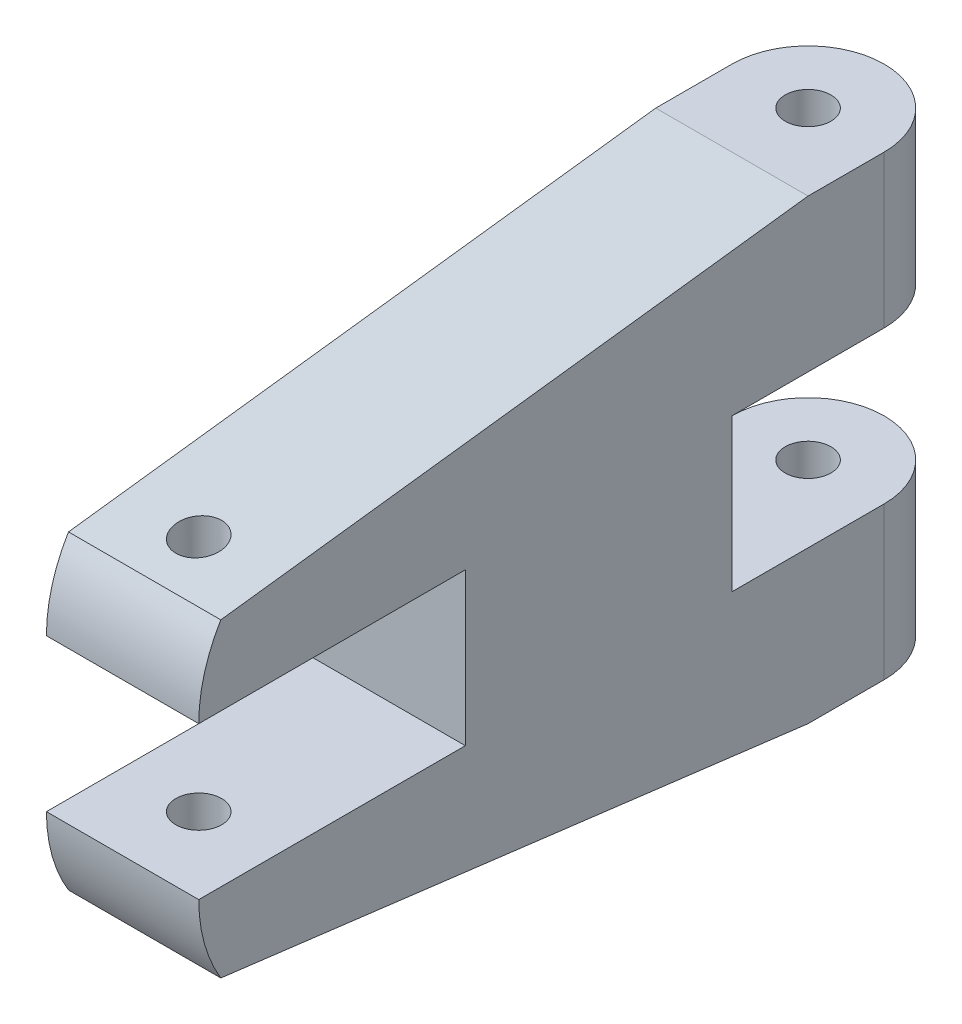
ISO-10303-21;
HEADER;
FILE_DESCRIPTION(('STEP AP214'),'2;1');
FILE_NAME('part.step','',(''),(''),'','','');
FILE_SCHEMA(('AUTOMOTIVE_DESIGN { 1 0 10303 214 1 1 1 1 }'));
ENDSEC;
DATA;
#1=APPLICATION_CONTEXT('core data for automotive mechanical design processes');
#2=APPLICATION_PROTOCOL_DEFINITION('international standard','automotive_design',2000,#1);
#3=PRODUCT_CONTEXT('',#1,'mechanical');
#4=PRODUCT('Part','Part','',(#3));
#5=PRODUCT_RELATED_PRODUCT_CATEGORY('part','',(#4));
#6=PRODUCT_DEFINITION_FORMATION('','',#4);
#7=PRODUCT_DEFINITION_CONTEXT('part definition',#1,'design');
#8=PRODUCT_DEFINITION('design','',#6,#7);
#9=PRODUCT_DEFINITION_SHAPE('','',#8);
#10=(LENGTH_UNIT() NAMED_UNIT(*) SI_UNIT(.MILLI.,.METRE.));
#11=(NAMED_UNIT(*) PLANE_ANGLE_UNIT() SI_UNIT($,.RADIAN.));
#12=(NAMED_UNIT(*) SI_UNIT($,.STERADIAN.) SOLID_ANGLE_UNIT());
#13=UNCERTAINTY_MEASURE_WITH_UNIT(LENGTH_MEASURE(1.E-05),#10,'distance_accuracy_value','');
#14=(GEOMETRIC_REPRESENTATION_CONTEXT(3) GLOBAL_UNCERTAINTY_ASSIGNED_CONTEXT((#13)) GLOBAL_UNIT_ASSIGNED_CONTEXT((#10,
#11,#12)) REPRESENTATION_CONTEXT('',''));
#15=CARTESIAN_POINT('',(0.,0.,0.));
#16=DIRECTION('',(0.,0.,1.));
#17=DIRECTION('',(1.,0.,0.));
#18=AXIS2_PLACEMENT_3D('',#15,#16,#17);
#19=CARTESIAN_POINT('',(5.,29.,-20.));
#20=DIRECTION('',(0.,-1.,0.));
#21=DIRECTION('',(0.,0.,-1.));
#22=AXIS2_PLACEMENT_3D('',#19,#20,#21);
#23=CYLINDRICAL_SURFACE('',#22,1.5);
#24=CARTESIAN_POINT('',(5.,-5.,-20.));
#25=DIRECTION('',(0.,-1.,0.));
#26=DIRECTION('',(0.,0.,-1.));
#27=AXIS2_PLACEMENT_3D('',#24,#25,#26);
#28=CIRCLE('',#27,1.5);
#29=CARTESIAN_POINT('',(5.,-5.,-21.5));
#30=VERTEX_POINT('',#29);
#31=EDGE_CURVE('E212',#30,#30,#28,.F.);
#32=CARTESIAN_POINT('',(5.,-15.,-20.));
#33=DIRECTION('',(0.,1.,0.));
#34=DIRECTION('',(0.,0.,1.));
#35=AXIS2_PLACEMENT_3D('',#32,#33,#34);
#36=CIRCLE('',#35,1.5);
#37=CARTESIAN_POINT('',(5.,-15.,-21.5));
#38=VERTEX_POINT('',#37);
#39=EDGE_CURVE('E202',#38,#38,#36,.T.);
#40=CARTESIAN_POINT('',(5.,-5.,-21.5));
#41=CARTESIAN_POINT('',(5.,-5.10416666666666,-21.5));
#42=CARTESIAN_POINT('',(5.,-5.20833333333333,-21.5));
#43=CARTESIAN_POINT('',(5.,-5.41666666666666,-21.5));
#44=CARTESIAN_POINT('',(5.,-5.52083333333333,-21.5));
#45=CARTESIAN_POINT('',(5.,-5.72916666666666,-21.5));
#46=CARTESIAN_POINT('',(5.,-5.83333333333333,-21.5));
#47=CARTESIAN_POINT('',(5.,-6.04166666666667,-21.5));
#48=CARTESIAN_POINT('',(5.,-6.14583333333333,-21.5));
#49=CARTESIAN_POINT('',(5.,-6.35416666666667,-21.5));
#50=CARTESIAN_POINT('',(5.,-6.45833333333333,-21.5));
#51=CARTESIAN_POINT('',(5.,-6.66666666666667,-21.5));
#52=CARTESIAN_POINT('',(5.,-6.77083333333333,-21.5));
#53=CARTESIAN_POINT('',(5.,-6.97916666666667,-21.5));
#54=CARTESIAN_POINT('',(5.,-7.08333333333333,-21.5));
#55=CARTESIAN_POINT('',(5.,-7.29166666666667,-21.5));
#56=CARTESIAN_POINT('',(5.,-7.39583333333333,-21.5));
#57=CARTESIAN_POINT('',(5.,-7.60416666666667,-21.5));
#58=CARTESIAN_POINT('',(5.,-7.70833333333333,-21.5));
#59=CARTESIAN_POINT('',(5.,-7.91666666666667,-21.5));
#60=CARTESIAN_POINT('',(5.,-8.02083333333333,-21.5));
#61=CARTESIAN_POINT('',(5.,-8.22916666666667,-21.5));
#62=CARTESIAN_POINT('',(5.,-8.33333333333333,-21.5));
#63=CARTESIAN_POINT('',(5.,-8.54166666666667,-21.5));
#64=CARTESIAN_POINT('',(5.,-8.64583333333333,-21.5));
#65=CARTESIAN_POINT('',(5.,-8.85416666666667,-21.5));
#66=CARTESIAN_POINT('',(5.,-8.95833333333333,-21.5));
#67=CARTESIAN_POINT('',(5.,-9.16666666666667,-21.5));
#68=CARTESIAN_POINT('',(5.,-9.27083333333333,-21.5));
#69=CARTESIAN_POINT('',(5.,-9.47916666666667,-21.5));
#70=CARTESIAN_POINT('',(5.,-9.58333333333333,-21.5));
#71=CARTESIAN_POINT('',(5.,-9.79166666666667,-21.5));
#72=CARTESIAN_POINT('',(5.,-9.89583333333333,-21.5));
#73=CARTESIAN_POINT('',(5.,-10.1041666666667,-21.5));
#74=CARTESIAN_POINT('',(5.,-10.2083333333333,-21.5));
#75=CARTESIAN_POINT('',(5.,-10.4166666666667,-21.5));
#76=CARTESIAN_POINT('',(5.,-10.5208333333333,-21.5));
#77=CARTESIAN_POINT('',(5.,-10.7291666666667,-21.5));
#78=CARTESIAN_POINT('',(5.,-10.8333333333333,-21.5));
#79=CARTESIAN_POINT('',(5.,-11.0416666666667,-21.5));
#80=CARTESIAN_POINT('',(5.,-11.1458333333333,-21.5));
#81=CARTESIAN_POINT('',(5.,-11.3541666666667,-21.5));
#82=CARTESIAN_POINT('',(5.,-11.4583333333333,-21.5));
#83=CARTESIAN_POINT('',(5.,-11.6666666666667,-21.5));
#84=CARTESIAN_POINT('',(5.,-11.7708333333333,-21.5));
#85=CARTESIAN_POINT('',(5.,-11.9791666666667,-21.5));
#86=CARTESIAN_POINT('',(5.,-12.0833333333333,-21.5));
#87=CARTESIAN_POINT('',(5.,-12.2916666666667,-21.5));
#88=CARTESIAN_POINT('',(5.,-12.3958333333333,-21.5));
#89=CARTESIAN_POINT('',(5.,-12.6041666666667,-21.5));
#90=CARTESIAN_POINT('',(5.,-12.7083333333333,-21.5));
#91=CARTESIAN_POINT('',(5.,-12.9166666666667,-21.5));
#92=CARTESIAN_POINT('',(5.,-13.0208333333333,-21.5));
#93=CARTESIAN_POINT('',(5.,-13.2291666666667,-21.5));
#94=CARTESIAN_POINT('',(5.,-13.3333333333333,-21.5));
#95=CARTESIAN_POINT('',(5.,-13.5416666666667,-21.5));
#96=CARTESIAN_POINT('',(5.,-13.6458333333333,-21.5));
#97=CARTESIAN_POINT('',(5.,-13.8541666666667,-21.5));
#98=CARTESIAN_POINT('',(5.,-13.9583333333333,-21.5));
#99=CARTESIAN_POINT('',(5.,-14.1666666666667,-21.5));
#100=CARTESIAN_POINT('',(5.,-14.2708333333333,-21.5));
#101=CARTESIAN_POINT('',(5.,-14.4791666666667,-21.5));
#102=CARTESIAN_POINT('',(5.,-14.5833333333333,-21.5));
#103=CARTESIAN_POINT('',(5.,-14.7916666666667,-21.5));
#104=CARTESIAN_POINT('',(5.,-14.8958333333333,-21.5));
#105=CARTESIAN_POINT('',(5.,-15.,-21.5));
#106=B_SPLINE_CURVE_WITH_KNOTS('',3,(#40,#41,#42,#43,#44,#45,#46,#47,#48,#49,#50,#51,#52,#53,
#54,#55,#56,#57,#58,#59,#60,#61,#62,#63,#64,#65,#66,#67,#68,#69,#70,#71,#72,#73,#74,#75,#76,#77,
#78,#79,#80,#81,#82,#83,#84,#85,#86,#87,#88,#89,#90,#91,#92,#93,#94,#95,#96,#97,#98,#99,#100,
#101,#102,#103,#104,#105),.UNSPECIFIED.,.F.,.F.,(4,2,2,2,2,2,2,2,2,2,2,2,2,2,2,2,2,2,2,2,2,2,2,
2,2,2,2,2,2,2,2,2,4),(0.,0.3125,0.625000000000001,0.937500000000001,1.25,1.5625,1.875,2.1875,
2.5,2.8125,3.125,3.4375,3.75,4.0625,4.375,4.6875,5.,5.3125,5.62500000000001,5.93750000000001,
6.25000000000001,6.56250000000001,6.87500000000001,7.18750000000001,7.50000000000001,
7.81250000000001,8.12500000000001,8.43750000000001,8.75000000000001,9.06250000000001,
9.37500000000001,9.68750000000001,10.),.UNSPECIFIED.);
#107=EDGE_CURVE('BSEAM33',#30,#38,#106,.T.);
#108=ORIENTED_EDGE('',*,*,#31,.T.);
#109=ORIENTED_EDGE('',*,*,#39,.F.);
#110=ORIENTED_EDGE('',*,*,#107,.T.);
#111=ORIENTED_EDGE('',*,*,#107,.F.);
#112=EDGE_LOOP('',(#108,#110,#109,#111));
#113=FACE_BOUND('',#112,.T.);
#114=ADVANCED_FACE('F33',(#113),#23,.F.);
#115=CARTESIAN_POINT('',(10.,15.,25.));
#116=DIRECTION('',(0.,-1.,0.));
#117=DIRECTION('',(0.,0.,-1.));
#118=AXIS2_PLACEMENT_3D('',#115,#116,#117);
#119=PLANE('',#118);
#120=CARTESIAN_POINT('',(5.,15.,-20.));
#121=DIRECTION('',(0.,-1.,0.));
#122=DIRECTION('',(0.,0.,-1.));
#123=AXIS2_PLACEMENT_3D('',#120,#121,#122);
#124=CIRCLE('',#123,1.5);
#125=CARTESIAN_POINT('',(5.,15.,-21.5));
#126=VERTEX_POINT('',#125);
#127=EDGE_CURVE('E205',#126,#126,#124,.T.);
#128=ORIENTED_EDGE('',*,*,#127,.T.);
#129=EDGE_LOOP('',(#128));
#130=FACE_BOUND('',#129,.T.);
#131=DIRECTION('',(0.,0.,1.));
#132=VECTOR('',#131,1.);
#133=CARTESIAN_POINT('',(0.,15.,25.));
#134=LINE('',#133,#132);
#135=CARTESIAN_POINT('',(0.,15.,-20.));
#136=VERTEX_POINT('',#135);
#137=CARTESIAN_POINT('',(0.,15.,-15.));
#138=VERTEX_POINT('',#137);
#139=EDGE_CURVE('E282',#136,#138,#134,.T.);
#140=ORIENTED_EDGE('',*,*,#139,.T.);
#141=DIRECTION('',(1.,0.,0.));
#142=VECTOR('',#141,1.);
#143=CARTESIAN_POINT('',(0.,15.,-15.));
#144=LINE('',#143,#142);
#145=CARTESIAN_POINT('',(10.,15.,-15.));
#146=VERTEX_POINT('',#145);
#147=EDGE_CURVE('E248',#138,#146,#144,.T.);
#148=ORIENTED_EDGE('',*,*,#147,.T.);
#149=DIRECTION('',(0.,0.,1.));
#150=VECTOR('',#149,1.);
#151=CARTESIAN_POINT('',(10.,15.,25.));
#152=LINE('',#151,#150);
#153=CARTESIAN_POINT('',(10.,15.,-20.));
#154=VERTEX_POINT('',#153);
#155=EDGE_CURVE('E168',#154,#146,#152,.T.);
#156=ORIENTED_EDGE('',*,*,#155,.F.);
#157=CARTESIAN_POINT('',(5.,15.,-20.));
#158=DIRECTION('',(0.,-1.,0.));
#159=DIRECTION('',(0.,0.,-1.));
#160=AXIS2_PLACEMENT_3D('',#157,#158,#159);
#161=CIRCLE('',#160,5.);
#162=CARTESIAN_POINT('',(5.,15.,-25.));
#163=VERTEX_POINT('',#162);
#164=EDGE_CURVE('E225',#154,#163,#161,.F.);
#165=ORIENTED_EDGE('',*,*,#164,.T.);
#166=CARTESIAN_POINT('',(5.,15.,-20.));
#167=DIRECTION('',(0.,-1.,0.));
#168=DIRECTION('',(0.,0.,-1.));
#169=AXIS2_PLACEMENT_3D('',#166,#167,#168);
#170=CIRCLE('',#169,5.);
#171=EDGE_CURVE('E223',#163,#136,#170,.F.);
#172=ORIENTED_EDGE('',*,*,#171,.T.);
#173=EDGE_LOOP('',(#140,#148,#156,#165,#172));
#174=FACE_BOUND('',#173,.T.);
#175=ADVANCED_FACE('F335',(#130,#174),#119,.F.);
#176=CARTESIAN_POINT('',(10.,5.,7.5));
#177=DIRECTION('',(0.,1.,0.));
#178=DIRECTION('',(0.,0.,1.));
#179=AXIS2_PLACEMENT_3D('',#176,#177,#178);
#180=PLANE('',#179);
#181=CARTESIAN_POINT('',(5.,5.,20.));
#182=DIRECTION('',(0.,1.,0.));
#183=DIRECTION('',(0.,0.,1.));
#184=AXIS2_PLACEMENT_3D('',#181,#182,#183);
#185=CIRCLE('',#184,1.5);
#186=CARTESIAN_POINT('',(5.,5.,21.5));
#187=VERTEX_POINT('',#186);
#188=EDGE_CURVE('E280',#187,#187,#185,.T.);
#189=ORIENTED_EDGE('',*,*,#188,.T.);
#190=EDGE_LOOP('',(#189));
#191=FACE_BOUND('',#190,.T.);
#192=DIRECTION('',(0.,0.,-1.));
#193=VECTOR('',#192,1.);
#194=CARTESIAN_POINT('',(0.,5.,7.5));
#195=LINE('',#194,#193);
#196=CARTESIAN_POINT('',(0.,5.,25.));
#197=VERTEX_POINT('',#196);
#198=CARTESIAN_POINT('',(0.,5.,7.5));
#199=VERTEX_POINT('',#198);
#200=EDGE_CURVE('E291',#197,#199,#195,.T.);
#201=ORIENTED_EDGE('',*,*,#200,.T.);
#202=DIRECTION('',(-1.,0.,0.));
#203=VECTOR('',#202,1.);
#204=CARTESIAN_POINT('',(10.,5.,7.5));
#205=LINE('',#204,#203);
#206=CARTESIAN_POINT('',(10.,5.,7.5));
#207=VERTEX_POINT('',#206);
#208=EDGE_CURVE('E185',#207,#199,#205,.T.);
#209=ORIENTED_EDGE('',*,*,#208,.F.);
#210=DIRECTION('',(0.,0.,-1.));
#211=VECTOR('',#210,1.);
#212=CARTESIAN_POINT('',(10.,5.,7.5));
#213=LINE('',#212,#211);
#214=CARTESIAN_POINT('',(10.,5.,25.));
#215=VERTEX_POINT('',#214);
#216=EDGE_CURVE('E172',#215,#207,#213,.T.);
#217=ORIENTED_EDGE('',*,*,#216,.F.);
#218=DIRECTION('',(-1.,0.,0.));
#219=VECTOR('',#218,1.);
#220=CARTESIAN_POINT('',(10.,5.,25.));
#221=LINE('',#220,#219);
#222=EDGE_CURVE('E188',#215,#197,#221,.T.);
#223=ORIENTED_EDGE('',*,*,#222,.T.);
#224=EDGE_LOOP('',(#201,#209,#217,#223));
#225=FACE_BOUND('',#224,.T.);
#226=ADVANCED_FACE('F314',(#191,#225),#180,.F.);
#227=CARTESIAN_POINT('',(10.,5.,7.5));
#228=DIRECTION('',(0.,0.,-1.));
#229=DIRECTION('',(0.,1.,0.));
#230=AXIS2_PLACEMENT_3D('',#227,#228,#229);
#231=PLANE('',#230);
#232=DIRECTION('',(0.,-1.,0.));
#233=VECTOR('',#232,1.);
#234=CARTESIAN_POINT('',(0.,5.,7.5));
#235=LINE('',#234,#233);
#236=CARTESIAN_POINT('',(0.,-5.,7.5));
#237=VERTEX_POINT('',#236);
#238=EDGE_CURVE('E175',#199,#237,#235,.T.);
#239=ORIENTED_EDGE('',*,*,#238,.T.);
#240=DIRECTION('',(-1.,0.,0.));
#241=VECTOR('',#240,1.);
#242=CARTESIAN_POINT('',(10.,-5.,7.5));
#243=LINE('',#242,#241);
#244=CARTESIAN_POINT('',(10.,-5.,7.5));
#245=VERTEX_POINT('',#244);
#246=EDGE_CURVE('E182',#245,#237,#243,.T.);
#247=ORIENTED_EDGE('',*,*,#246,.F.);
#248=DIRECTION('',(0.,-1.,0.));
#249=VECTOR('',#248,1.);
#250=CARTESIAN_POINT('',(10.,5.,7.5));
#251=LINE('',#250,#249);
#252=EDGE_CURVE('E285',#207,#245,#251,.T.);
#253=ORIENTED_EDGE('',*,*,#252,.F.);
#254=ORIENTED_EDGE('',*,*,#208,.T.);
#255=EDGE_LOOP('',(#239,#247,#253,#254));
#256=FACE_BOUND('',#255,.T.);
#257=ADVANCED_FACE('F295',(#256),#231,.F.);
#258=CARTESIAN_POINT('',(10.,-5.,7.5));
#259=DIRECTION('',(0.,-1.,0.));
#260=DIRECTION('',(0.,0.,-1.));
#261=AXIS2_PLACEMENT_3D('',#258,#259,#260);
#262=PLANE('',#261);
#263=CARTESIAN_POINT('',(5.,-5.,20.));
#264=DIRECTION('',(0.,-1.,0.));
#265=DIRECTION('',(0.,0.,-1.));
#266=AXIS2_PLACEMENT_3D('',#263,#264,#265);
#267=CIRCLE('',#266,1.5);
#268=CARTESIAN_POINT('',(5.,-5.,18.5));
#269=VERTEX_POINT('',#268);
#270=EDGE_CURVE('E277',#269,#269,#267,.T.);
#271=ORIENTED_EDGE('',*,*,#270,.T.);
#272=EDGE_LOOP('',(#271));
#273=FACE_BOUND('',#272,.T.);
#274=DIRECTION('',(0.,0.,1.));
#275=VECTOR('',#274,1.);
#276=CARTESIAN_POINT('',(0.,-5.,7.5));
#277=LINE('',#276,#275);
#278=CARTESIAN_POINT('',(0.,-5.,25.));
#279=VERTEX_POINT('',#278);
#280=EDGE_CURVE('E169',#237,#279,#277,.T.);
#281=ORIENTED_EDGE('',*,*,#280,.T.);
#282=DIRECTION('',(-1.,0.,0.));
#283=VECTOR('',#282,1.);
#284=CARTESIAN_POINT('',(10.,-5.,25.));
#285=LINE('',#284,#283);
#286=CARTESIAN_POINT('',(10.,-5.,25.));
#287=VERTEX_POINT('',#286);
#288=EDGE_CURVE('E179',#287,#279,#285,.T.);
#289=ORIENTED_EDGE('',*,*,#288,.F.);
#290=DIRECTION('',(0.,0.,1.));
#291=VECTOR('',#290,1.);
#292=CARTESIAN_POINT('',(10.,-5.,7.5));
#293=LINE('',#292,#291);
#294=EDGE_CURVE('E287',#245,#287,#293,.T.);
#295=ORIENTED_EDGE('',*,*,#294,.F.);
#296=ORIENTED_EDGE('',*,*,#246,.T.);
#297=EDGE_LOOP('',(#281,#289,#295,#296));
#298=FACE_BOUND('',#297,.T.);
#299=ADVANCED_FACE('F302',(#273,#298),#262,.F.);
#300=CARTESIAN_POINT('',(10.,-15.,25.));
#301=DIRECTION('',(0.,1.,0.));
#302=DIRECTION('',(0.,0.,1.));
#303=AXIS2_PLACEMENT_3D('',#300,#301,#302);
#304=PLANE('',#303);
#305=ORIENTED_EDGE('',*,*,#39,.T.);
#306=EDGE_LOOP('',(#305));
#307=FACE_BOUND('',#306,.T.);
#308=DIRECTION('',(0.,0.,-1.));
#309=VECTOR('',#308,1.);
#310=CARTESIAN_POINT('',(10.,-15.,25.));
#311=LINE('',#310,#309);
#312=CARTESIAN_POINT('',(10.,-15.,-15.));
#313=VERTEX_POINT('',#312);
#314=CARTESIAN_POINT('',(10.,-15.,-20.));
#315=VERTEX_POINT('',#314);
#316=EDGE_CURVE('E161',#313,#315,#311,.T.);
#317=ORIENTED_EDGE('',*,*,#316,.F.);
#318=DIRECTION('',(1.,0.,0.));
#319=VECTOR('',#318,1.);
#320=CARTESIAN_POINT('',(0.,-15.,-15.));
#321=LINE('',#320,#319);
#322=CARTESIAN_POINT('',(0.,-15.,-15.));
#323=VERTEX_POINT('',#322);
#324=EDGE_CURVE('E150',#323,#313,#321,.T.);
#325=ORIENTED_EDGE('',*,*,#324,.F.);
#326=DIRECTION('',(0.,0.,-1.));
#327=VECTOR('',#326,1.);
#328=CARTESIAN_POINT('',(0.,-15.,25.));
#329=LINE('',#328,#327);
#330=CARTESIAN_POINT('',(0.,-15.,-20.));
#331=VERTEX_POINT('',#330);
#332=EDGE_CURVE('E159',#323,#331,#329,.T.);
#333=ORIENTED_EDGE('',*,*,#332,.T.);
#334=CARTESIAN_POINT('',(5.,-15.,-20.));
#335=DIRECTION('',(0.,1.,0.));
#336=DIRECTION('',(0.,0.,1.));
#337=AXIS2_PLACEMENT_3D('',#334,#335,#336);
#338=CIRCLE('',#337,5.);
#339=CARTESIAN_POINT('',(5.,-15.,-25.));
#340=VERTEX_POINT('',#339);
#341=EDGE_CURVE('E42',#331,#340,#338,.F.);
#342=ORIENTED_EDGE('',*,*,#341,.T.);
#343=CARTESIAN_POINT('',(5.,-15.,-20.));
#344=DIRECTION('',(0.,1.,0.));
#345=DIRECTION('',(0.,0.,1.));
#346=AXIS2_PLACEMENT_3D('',#343,#344,#345);
#347=CIRCLE('',#346,5.);
#348=EDGE_CURVE('E11',#340,#315,#347,.F.);
#349=ORIENTED_EDGE('',*,*,#348,.T.);
#350=EDGE_LOOP('',(#317,#325,#333,#342,#349));
#351=FACE_BOUND('',#350,.T.);
#352=ADVANCED_FACE('F158',(#307,#351),#304,.F.);
#353=CARTESIAN_POINT('',(10.,0.,0.));
#354=DIRECTION('',(-1.,0.,0.));
#355=DIRECTION('',(0.,0.,1.));
#356=AXIS2_PLACEMENT_3D('',#353,#354,#355);
#357=PLANE('',#356);
#358=CARTESIAN_POINT('',(10.,-5.,15.));
#359=DIRECTION('',(-1.,0.,0.));
#360=DIRECTION('',(0.,0.,1.));
#361=AXIS2_PLACEMENT_3D('',#358,#359,#360);
#362=CIRCLE('',#361,10.);
#363=CARTESIAN_POINT('',(10.,-10.1808376430251,23.5532988557991));
#364=VERTEX_POINT('',#363);
#365=EDGE_CURVE('E196',#287,#364,#362,.F.);
#366=ORIENTED_EDGE('',*,*,#365,.T.);
#367=DIRECTION('',(0.,0.124034734589209,0.992277876713668));
#368=VECTOR('',#367,1.);
#369=CARTESIAN_POINT('',(10.,-10.,25.));
#370=LINE('',#369,#368);
#371=EDGE_CURVE('E50',#313,#364,#370,.T.);
#372=ORIENTED_EDGE('',*,*,#371,.F.);
#373=ORIENTED_EDGE('',*,*,#316,.T.);
#374=DIRECTION('',(0.,1.,0.));
#375=VECTOR('',#374,1.);
#376=CARTESIAN_POINT('',(10.,0.,-20.));
#377=LINE('',#376,#375);
#378=CARTESIAN_POINT('',(10.,-5.,-20.));
#379=VERTEX_POINT('',#378);
#380=EDGE_CURVE('E217',#315,#379,#377,.T.);
#381=ORIENTED_EDGE('',*,*,#380,.T.);
#382=DIRECTION('',(0.,0.,-1.));
#383=VECTOR('',#382,1.);
#384=CARTESIAN_POINT('',(10.,-5.,-25.));
#385=LINE('',#384,#383);
#386=CARTESIAN_POINT('',(10.,-5.,-10.));
#387=VERTEX_POINT('',#386);
#388=EDGE_CURVE('E265',#387,#379,#385,.T.);
#389=ORIENTED_EDGE('',*,*,#388,.F.);
#390=DIRECTION('',(0.,-1.,0.));
#391=VECTOR('',#390,1.);
#392=CARTESIAN_POINT('',(10.,-5.,-10.));
#393=LINE('',#392,#391);
#394=CARTESIAN_POINT('',(10.,5.,-10.));
#395=VERTEX_POINT('',#394);
#396=EDGE_CURVE('E262',#395,#387,#393,.T.);
#397=ORIENTED_EDGE('',*,*,#396,.F.);
#398=DIRECTION('',(0.,0.,1.));
#399=VECTOR('',#398,1.);
#400=CARTESIAN_POINT('',(10.,5.,-25.));
#401=LINE('',#400,#399);
#402=CARTESIAN_POINT('',(10.,5.,-20.));
#403=VERTEX_POINT('',#402);
#404=EDGE_CURVE('E242',#403,#395,#401,.T.);
#405=ORIENTED_EDGE('',*,*,#404,.F.);
#406=DIRECTION('',(0.,1.,0.));
#407=VECTOR('',#406,1.);
#408=CARTESIAN_POINT('',(10.,0.,-20.));
#409=LINE('',#408,#407);
#410=EDGE_CURVE('E220',#403,#154,#409,.T.);
#411=ORIENTED_EDGE('',*,*,#410,.T.);
#412=ORIENTED_EDGE('',*,*,#155,.T.);
#413=DIRECTION('',(0.,0.124034734589209,-0.992277876713668));
#414=VECTOR('',#413,1.);
#415=CARTESIAN_POINT('',(10.,10.,25.));
#416=LINE('',#415,#414);
#417=CARTESIAN_POINT('',(10.,10.1808376430251,23.5532988557991));
#418=VERTEX_POINT('',#417);
#419=EDGE_CURVE('E257',#418,#146,#416,.T.);
#420=ORIENTED_EDGE('',*,*,#419,.F.);
#421=CARTESIAN_POINT('',(10.,5.,15.));
#422=DIRECTION('',(-1.,0.,0.));
#423=DIRECTION('',(0.,0.,1.));
#424=AXIS2_PLACEMENT_3D('',#421,#422,#423);
#425=CIRCLE('',#424,10.);
#426=EDGE_CURVE('E199',#418,#215,#425,.F.);
#427=ORIENTED_EDGE('',*,*,#426,.T.);
#428=ORIENTED_EDGE('',*,*,#216,.T.);
#429=ORIENTED_EDGE('',*,*,#252,.T.);
#430=ORIENTED_EDGE('',*,*,#294,.T.);
#431=EDGE_LOOP('',(#366,#372,#373,#381,#389,#397,#405,#411,#412,#420,#427,#428,#429,#430));
#432=FACE_BOUND('',#431,.T.);
#433=ADVANCED_FACE('F308',(#432),#357,.F.);
#434=CARTESIAN_POINT('',(0.,0.,0.));
#435=DIRECTION('',(-1.,0.,0.));
#436=DIRECTION('',(0.,0.,1.));
#437=AXIS2_PLACEMENT_3D('',#434,#435,#436);
#438=PLANE('',#437);
#439=DIRECTION('',(0.,0.124034734589209,0.992277876713668));
#440=VECTOR('',#439,1.);
#441=CARTESIAN_POINT('',(0.,-10.,25.));
#442=LINE('',#441,#440);
#443=CARTESIAN_POINT('',(0.,-10.1808376430251,23.5532988557991));
#444=VERTEX_POINT('',#443);
#445=EDGE_CURVE('E146',#323,#444,#442,.T.);
#446=ORIENTED_EDGE('',*,*,#445,.T.);
#447=CARTESIAN_POINT('',(0.,-5.,15.));
#448=DIRECTION('',(-1.,0.,0.));
#449=DIRECTION('',(0.,0.,1.));
#450=AXIS2_PLACEMENT_3D('',#447,#448,#449);
#451=CIRCLE('',#450,10.);
#452=EDGE_CURVE('E191',#444,#279,#451,.T.);
#453=ORIENTED_EDGE('',*,*,#452,.T.);
#454=ORIENTED_EDGE('',*,*,#280,.F.);
#455=ORIENTED_EDGE('',*,*,#238,.F.);
#456=ORIENTED_EDGE('',*,*,#200,.F.);
#457=CARTESIAN_POINT('',(0.,5.,15.));
#458=DIRECTION('',(-1.,0.,0.));
#459=DIRECTION('',(0.,0.,1.));
#460=AXIS2_PLACEMENT_3D('',#457,#458,#459);
#461=CIRCLE('',#460,10.);
#462=CARTESIAN_POINT('',(0.,10.1808376430251,23.5532988557991));
#463=VERTEX_POINT('',#462);
#464=EDGE_CURVE('E193',#197,#463,#461,.T.);
#465=ORIENTED_EDGE('',*,*,#464,.T.);
#466=DIRECTION('',(0.,0.124034734589209,-0.992277876713668));
#467=VECTOR('',#466,1.);
#468=CARTESIAN_POINT('',(0.,10.,25.));
#469=LINE('',#468,#467);
#470=EDGE_CURVE('E58',#463,#138,#469,.T.);
#471=ORIENTED_EDGE('',*,*,#470,.T.);
#472=ORIENTED_EDGE('',*,*,#139,.F.);
#473=DIRECTION('',(0.,1.,0.));
#474=VECTOR('',#473,1.);
#475=CARTESIAN_POINT('',(0.,5.,-20.));
#476=LINE('',#475,#474);
#477=CARTESIAN_POINT('',(0.,5.,-20.));
#478=VERTEX_POINT('',#477);
#479=EDGE_CURVE('E232',#136,#478,#476,.F.);
#480=ORIENTED_EDGE('',*,*,#479,.T.);
#481=DIRECTION('',(0.,0.,-1.));
#482=VECTOR('',#481,1.);
#483=CARTESIAN_POINT('',(0.,5.,0.));
#484=LINE('',#483,#482);
#485=CARTESIAN_POINT('',(0.,5.,-10.));
#486=VERTEX_POINT('',#485);
#487=EDGE_CURVE('E210',#486,#478,#484,.T.);
#488=ORIENTED_EDGE('',*,*,#487,.F.);
#489=DIRECTION('',(0.,1.,0.));
#490=VECTOR('',#489,1.);
#491=CARTESIAN_POINT('',(0.,0.,-10.));
#492=LINE('',#491,#490);
#493=CARTESIAN_POINT('',(0.,-5.,-10.));
#494=VERTEX_POINT('',#493);
#495=EDGE_CURVE('E201',#494,#486,#492,.T.);
#496=ORIENTED_EDGE('',*,*,#495,.F.);
#497=DIRECTION('',(0.,0.,1.));
#498=VECTOR('',#497,1.);
#499=CARTESIAN_POINT('',(0.,-5.,0.));
#500=LINE('',#499,#498);
#501=CARTESIAN_POINT('',(0.,-5.,-20.));
#502=VERTEX_POINT('',#501);
#503=EDGE_CURVE('E206',#502,#494,#500,.T.);
#504=ORIENTED_EDGE('',*,*,#503,.F.);
#505=DIRECTION('',(0.,1.,0.));
#506=VECTOR('',#505,1.);
#507=CARTESIAN_POINT('',(0.,-15.,-20.));
#508=LINE('',#507,#506);
#509=EDGE_CURVE('E166',#502,#331,#508,.F.);
#510=ORIENTED_EDGE('',*,*,#509,.T.);
#511=ORIENTED_EDGE('',*,*,#332,.F.);
#512=EDGE_LOOP('',(#446,#453,#454,#455,#456,#465,#471,#472,#480,#488,#496,#504,#510,#511));
#513=FACE_BOUND('',#512,.T.);
#514=ADVANCED_FACE('F163',(#513),#438,.T.);
#515=CARTESIAN_POINT('',(10.,5.,15.));
#516=DIRECTION('',(-1.,0.,0.));
#517=DIRECTION('',(0.,0.,1.));
#518=AXIS2_PLACEMENT_3D('',#515,#516,#517);
#519=CYLINDRICAL_SURFACE('',#518,10.);
#520=DIRECTION('',(-1.,0.,0.));
#521=VECTOR('',#520,1.);
#522=CARTESIAN_POINT('',(10.,10.1808376430251,23.5532988557991));
#523=LINE('',#522,#521);
#524=EDGE_CURVE('E245',#463,#418,#523,.F.);
#525=ORIENTED_EDGE('',*,*,#524,.F.);
#526=ORIENTED_EDGE('',*,*,#464,.F.);
#527=ORIENTED_EDGE('',*,*,#222,.F.);
#528=ORIENTED_EDGE('',*,*,#426,.F.);
#529=EDGE_LOOP('',(#525,#526,#527,#528));
#530=FACE_BOUND('',#529,.T.);
#531=ADVANCED_FACE('F317',(#530),#519,.T.);
#532=CARTESIAN_POINT('',(10.,-5.,15.));
#533=DIRECTION('',(-1.,0.,0.));
#534=DIRECTION('',(0.,0.,1.));
#535=AXIS2_PLACEMENT_3D('',#532,#533,#534);
#536=CYLINDRICAL_SURFACE('',#535,10.);
#537=DIRECTION('',(-1.,0.,0.));
#538=VECTOR('',#537,1.);
#539=CARTESIAN_POINT('',(10.,-10.1808376430251,23.5532988557991));
#540=LINE('',#539,#538);
#541=EDGE_CURVE('E151',#364,#444,#540,.T.);
#542=ORIENTED_EDGE('',*,*,#541,.F.);
#543=ORIENTED_EDGE('',*,*,#365,.F.);
#544=ORIENTED_EDGE('',*,*,#288,.T.);
#545=ORIENTED_EDGE('',*,*,#452,.F.);
#546=EDGE_LOOP('',(#542,#543,#544,#545));
#547=FACE_BOUND('',#546,.T.);
#548=ADVANCED_FACE('F305',(#547),#536,.T.);
#549=CARTESIAN_POINT('',(5.,29.,20.));
#550=DIRECTION('',(0.,-1.,0.));
#551=DIRECTION('',(0.,0.,-1.));
#552=AXIS2_PLACEMENT_3D('',#549,#550,#551);
#553=CYLINDRICAL_SURFACE('',#552,1.5);
#554=CARTESIAN_POINT('',(5.,-10.625,20.));
#555=DIRECTION('',(0.,0.992277876713668,-0.124034734589209));
#556=DIRECTION('',(0.,-0.124034734589209,-0.992277876713668));
#557=AXIS2_PLACEMENT_3D('',#554,#555,#556);
#558=ELLIPSE('',#557,1.51167332780598,1.5);
#559=CARTESIAN_POINT('',(5.,-10.8125,18.5));
#560=VERTEX_POINT('',#559);
#561=EDGE_CURVE('E37',#560,#560,#558,.F.);
#562=ORIENTED_EDGE('',*,*,#561,.T.);
#563=EDGE_LOOP('',(#562));
#564=FACE_BOUND('',#563,.T.);
#565=ORIENTED_EDGE('',*,*,#270,.F.);
#566=EDGE_LOOP('',(#565));
#567=FACE_BOUND('',#566,.T.);
#568=ADVANCED_FACE('F325',(#564,#567),#553,.F.);
#569=CARTESIAN_POINT('',(5.,10.625,20.));
#570=DIRECTION('',(0.,-0.992277876713668,-0.124034734589209));
#571=DIRECTION('',(0.,-0.124034734589209,0.992277876713668));
#572=AXIS2_PLACEMENT_3D('',#569,#570,#571);
#573=ELLIPSE('',#572,1.51167332780598,1.5);
#574=CARTESIAN_POINT('',(5.,10.4375,21.5));
#575=VERTEX_POINT('',#574);
#576=EDGE_CURVE('E246',#575,#575,#573,.F.);
#577=ORIENTED_EDGE('',*,*,#576,.T.);
#578=EDGE_LOOP('',(#577));
#579=FACE_BOUND('',#578,.T.);
#580=ORIENTED_EDGE('',*,*,#188,.F.);
#581=EDGE_LOOP('',(#580));
#582=FACE_BOUND('',#581,.T.);
#583=ADVANCED_FACE('F349',(#579,#582),#553,.F.);
#584=CARTESIAN_POINT('',(5.,5.,-20.));
#585=DIRECTION('',(0.,1.,0.));
#586=DIRECTION('',(0.,0.,1.));
#587=AXIS2_PLACEMENT_3D('',#584,#585,#586);
#588=CIRCLE('',#587,1.5);
#589=CARTESIAN_POINT('',(5.,5.,-21.5));
#590=VERTEX_POINT('',#589);
#591=EDGE_CURVE('E207',#590,#590,#588,.F.);
#592=CARTESIAN_POINT('',(5.,5.,-21.5));
#593=CARTESIAN_POINT('',(5.,5.10416666666667,-21.5));
#594=CARTESIAN_POINT('',(5.,5.20833333333333,-21.5));
#595=CARTESIAN_POINT('',(5.,5.41666666666667,-21.5));
#596=CARTESIAN_POINT('',(5.,5.52083333333333,-21.5));
#597=CARTESIAN_POINT('',(5.,5.72916666666667,-21.5));
#598=CARTESIAN_POINT('',(5.,5.83333333333334,-21.5));
#599=CARTESIAN_POINT('',(5.,6.04166666666667,-21.5));
#600=CARTESIAN_POINT('',(5.,6.14583333333334,-21.5));
#601=CARTESIAN_POINT('',(5.,6.35416666666667,-21.5));
#602=CARTESIAN_POINT('',(5.,6.45833333333334,-21.5));
#603=CARTESIAN_POINT('',(5.,6.66666666666667,-21.5));
#604=CARTESIAN_POINT('',(5.,6.77083333333333,-21.5));
#605=CARTESIAN_POINT('',(5.,6.97916666666667,-21.5));
#606=CARTESIAN_POINT('',(5.,7.08333333333333,-21.5));
#607=CARTESIAN_POINT('',(5.,7.29166666666667,-21.5));
#608=CARTESIAN_POINT('',(5.,7.39583333333333,-21.5));
#609=CARTESIAN_POINT('',(5.,7.60416666666667,-21.5));
#610=CARTESIAN_POINT('',(5.,7.70833333333333,-21.5));
#611=CARTESIAN_POINT('',(5.,7.91666666666667,-21.5));
#612=CARTESIAN_POINT('',(5.,8.02083333333333,-21.5));
#613=CARTESIAN_POINT('',(5.,8.22916666666667,-21.5));
#614=CARTESIAN_POINT('',(5.,8.33333333333333,-21.5));
#615=CARTESIAN_POINT('',(5.,8.54166666666667,-21.5));
#616=CARTESIAN_POINT('',(5.,8.64583333333333,-21.5));
#617=CARTESIAN_POINT('',(5.,8.85416666666667,-21.5));
#618=CARTESIAN_POINT('',(5.,8.95833333333333,-21.5));
#619=CARTESIAN_POINT('',(5.,9.16666666666667,-21.5));
#620=CARTESIAN_POINT('',(5.,9.27083333333333,-21.5));
#621=CARTESIAN_POINT('',(5.,9.47916666666667,-21.5));
#622=CARTESIAN_POINT('',(5.,9.58333333333333,-21.5));
#623=CARTESIAN_POINT('',(5.,9.79166666666667,-21.5));
#624=CARTESIAN_POINT('',(5.,9.89583333333333,-21.5));
#625=CARTESIAN_POINT('',(5.,10.1041666666667,-21.5));
#626=CARTESIAN_POINT('',(5.,10.2083333333333,-21.5));
#627=CARTESIAN_POINT('',(5.,10.4166666666667,-21.5));
#628=CARTESIAN_POINT('',(5.,10.5208333333333,-21.5));
#629=CARTESIAN_POINT('',(5.,10.7291666666667,-21.5));
#630=CARTESIAN_POINT('',(5.,10.8333333333333,-21.5));
#631=CARTESIAN_POINT('',(5.,11.0416666666667,-21.5));
#632=CARTESIAN_POINT('',(5.,11.1458333333333,-21.5));
#633=CARTESIAN_POINT('',(5.,11.3541666666667,-21.5));
#634=CARTESIAN_POINT('',(5.,11.4583333333333,-21.5));
#635=CARTESIAN_POINT('',(5.,11.6666666666667,-21.5));
#636=CARTESIAN_POINT('',(5.,11.7708333333333,-21.5));
#637=CARTESIAN_POINT('',(5.,11.9791666666667,-21.5));
#638=CARTESIAN_POINT('',(5.,12.0833333333333,-21.5));
#639=CARTESIAN_POINT('',(5.,12.2916666666667,-21.5));
#640=CARTESIAN_POINT('',(5.,12.3958333333333,-21.5));
#641=CARTESIAN_POINT('',(5.,12.6041666666667,-21.5));
#642=CARTESIAN_POINT('',(5.,12.7083333333333,-21.5));
#643=CARTESIAN_POINT('',(5.,12.9166666666667,-21.5));
#644=CARTESIAN_POINT('',(5.,13.0208333333333,-21.5));
#645=CARTESIAN_POINT('',(5.,13.2291666666667,-21.5));
#646=CARTESIAN_POINT('',(5.,13.3333333333333,-21.5));
#647=CARTESIAN_POINT('',(5.,13.5416666666667,-21.5));
#648=CARTESIAN_POINT('',(5.,13.6458333333333,-21.5));
#649=CARTESIAN_POINT('',(5.,13.8541666666667,-21.5));
#650=CARTESIAN_POINT('',(5.,13.9583333333333,-21.5));
#651=CARTESIAN_POINT('',(5.,14.1666666666667,-21.5));
#652=CARTESIAN_POINT('',(5.,14.2708333333333,-21.5));
#653=CARTESIAN_POINT('',(5.,14.4791666666667,-21.5));
#654=CARTESIAN_POINT('',(5.,14.5833333333333,-21.5));
#655=CARTESIAN_POINT('',(5.,14.7916666666667,-21.5));
#656=CARTESIAN_POINT('',(5.,14.8958333333333,-21.5));
#657=CARTESIAN_POINT('',(5.,15.,-21.5));
#658=B_SPLINE_CURVE_WITH_KNOTS('',3,(#592,#593,#594,#595,#596,#597,#598,#599,#600,#601,#602,
#603,#604,#605,#606,#607,#608,#609,#610,#611,#612,#613,#614,#615,#616,#617,#618,#619,#620,#621,
#622,#623,#624,#625,#626,#627,#628,#629,#630,#631,#632,#633,#634,#635,#636,#637,#638,#639,#640,
#641,#642,#643,#644,#645,#646,#647,#648,#649,#650,#651,#652,#653,#654,#655,#656,#657),
.UNSPECIFIED.,.F.,.F.,(4,2,2,2,2,2,2,2,2,2,2,2,2,2,2,2,2,2,2,2,2,2,2,2,2,2,2,2,2,2,2,2,4),(0.,
0.3125,0.625000000000001,0.937500000000001,1.25,1.5625,1.875,2.1875,2.5,2.8125,3.125,3.4375,
3.75,4.0625,4.375,4.6875,5.,5.3125,5.625,5.9375,6.25,6.5625,6.875,7.1875,7.5,7.8125,8.125,
8.4375,8.75,9.0625,9.375,9.6875,10.),.UNSPECIFIED.);
#659=EDGE_CURVE('BSEAM338',#590,#126,#658,.T.);
#660=ORIENTED_EDGE('',*,*,#591,.T.);
#661=ORIENTED_EDGE('',*,*,#127,.F.);
#662=ORIENTED_EDGE('',*,*,#659,.T.);
#663=ORIENTED_EDGE('',*,*,#659,.F.);
#664=EDGE_LOOP('',(#660,#662,#661,#663));
#665=FACE_BOUND('',#664,.T.);
#666=ADVANCED_FACE('F338',(#665),#23,.F.);
#667=CARTESIAN_POINT('',(-38.,-5.,-25.));
#668=DIRECTION('',(0.,-1.,0.));
#669=DIRECTION('',(0.,0.,-1.));
#670=AXIS2_PLACEMENT_3D('',#667,#668,#669);
#671=PLANE('',#670);
#672=ORIENTED_EDGE('',*,*,#388,.T.);
#673=CARTESIAN_POINT('',(5.,-5.,-20.));
#674=DIRECTION('',(0.,-1.,0.));
#675=DIRECTION('',(0.,0.,-1.));
#676=AXIS2_PLACEMENT_3D('',#673,#674,#675);
#677=CIRCLE('',#676,5.);
#678=CARTESIAN_POINT('',(4.99999999999998,-5.,-25.));
#679=VERTEX_POINT('',#678);
#680=EDGE_CURVE('E236',#379,#679,#677,.F.);
#681=ORIENTED_EDGE('',*,*,#680,.T.);
#682=CARTESIAN_POINT('',(5.,-5.,-20.));
#683=DIRECTION('',(0.,-1.,0.));
#684=DIRECTION('',(0.,0.,-1.));
#685=AXIS2_PLACEMENT_3D('',#682,#683,#684);
#686=CIRCLE('',#685,5.);
#687=EDGE_CURVE('E234',#679,#502,#686,.F.);
#688=ORIENTED_EDGE('',*,*,#687,.T.);
#689=ORIENTED_EDGE('',*,*,#503,.T.);
#690=DIRECTION('',(1.,0.,0.));
#691=VECTOR('',#690,1.);
#692=CARTESIAN_POINT('',(-38.,-5.,-10.));
#693=LINE('',#692,#691);
#694=EDGE_CURVE('E211',#494,#387,#693,.T.);
#695=ORIENTED_EDGE('',*,*,#694,.T.);
#696=EDGE_LOOP('',(#672,#681,#688,#689,#695));
#697=FACE_BOUND('',#696,.T.);
#698=ORIENTED_EDGE('',*,*,#31,.F.);
#699=EDGE_LOOP('',(#698));
#700=FACE_BOUND('',#699,.T.);
#701=ADVANCED_FACE('F348',(#697,#700),#671,.F.);
#702=CARTESIAN_POINT('',(-38.,5.,-25.));
#703=DIRECTION('',(0.,1.,0.));
#704=DIRECTION('',(0.,0.,1.));
#705=AXIS2_PLACEMENT_3D('',#702,#703,#704);
#706=PLANE('',#705);
#707=CARTESIAN_POINT('',(5.,5.,-20.));
#708=DIRECTION('',(0.,1.,0.));
#709=DIRECTION('',(0.,0.,1.));
#710=AXIS2_PLACEMENT_3D('',#707,#708,#709);
#711=CIRCLE('',#710,5.);
#712=CARTESIAN_POINT('',(4.99999999999998,5.,-25.));
#713=VERTEX_POINT('',#712);
#714=EDGE_CURVE('E227',#478,#713,#711,.F.);
#715=ORIENTED_EDGE('',*,*,#714,.T.);
#716=CARTESIAN_POINT('',(5.,5.,-20.));
#717=DIRECTION('',(0.,1.,0.));
#718=DIRECTION('',(0.,0.,1.));
#719=AXIS2_PLACEMENT_3D('',#716,#717,#718);
#720=CIRCLE('',#719,5.);
#721=EDGE_CURVE('E229',#713,#403,#720,.F.);
#722=ORIENTED_EDGE('',*,*,#721,.T.);
#723=ORIENTED_EDGE('',*,*,#404,.T.);
#724=DIRECTION('',(1.,0.,0.));
#725=VECTOR('',#724,1.);
#726=CARTESIAN_POINT('',(-38.,5.,-10.));
#727=LINE('',#726,#725);
#728=EDGE_CURVE('E268',#486,#395,#727,.T.);
#729=ORIENTED_EDGE('',*,*,#728,.F.);
#730=ORIENTED_EDGE('',*,*,#487,.T.);
#731=EDGE_LOOP('',(#715,#722,#723,#729,#730));
#732=FACE_BOUND('',#731,.T.);
#733=ORIENTED_EDGE('',*,*,#591,.F.);
#734=EDGE_LOOP('',(#733));
#735=FACE_BOUND('',#734,.T.);
#736=ADVANCED_FACE('F355',(#732,#735),#706,.F.);
#737=CARTESIAN_POINT('',(-38.,-5.,-10.));
#738=DIRECTION('',(0.,0.,1.));
#739=DIRECTION('',(1.,0.,0.));
#740=AXIS2_PLACEMENT_3D('',#737,#738,#739);
#741=PLANE('',#740);
#742=ORIENTED_EDGE('',*,*,#495,.T.);
#743=ORIENTED_EDGE('',*,*,#728,.T.);
#744=ORIENTED_EDGE('',*,*,#396,.T.);
#745=ORIENTED_EDGE('',*,*,#694,.F.);
#746=EDGE_LOOP('',(#742,#743,#744,#745));
#747=FACE_BOUND('',#746,.T.);
#748=ADVANCED_FACE('F375',(#747),#741,.F.);
#749=CARTESIAN_POINT('',(5.,-5.,-20.));
#750=DIRECTION('',(0.,-1.,0.));
#751=DIRECTION('',(0.,0.,-1.));
#752=AXIS2_PLACEMENT_3D('',#749,#750,#751);
#753=CYLINDRICAL_SURFACE('',#752,5.);
#754=DIRECTION('',(0.,1.,0.));
#755=VECTOR('',#754,1.);
#756=CARTESIAN_POINT('',(5.,15.,-25.));
#757=LINE('',#756,#755);
#758=EDGE_CURVE('E239',#713,#163,#757,.T.);
#759=ORIENTED_EDGE('',*,*,#758,.F.);
#760=ORIENTED_EDGE('',*,*,#714,.F.);
#761=ORIENTED_EDGE('',*,*,#479,.F.);
#762=ORIENTED_EDGE('',*,*,#171,.F.);
#763=EDGE_LOOP('',(#759,#760,#761,#762));
#764=FACE_BOUND('',#763,.T.);
#765=ADVANCED_FACE('F367',(#764),#753,.T.);
#766=CARTESIAN_POINT('',(5.,0.,-20.));
#767=DIRECTION('',(0.,1.,0.));
#768=DIRECTION('',(0.,0.,1.));
#769=AXIS2_PLACEMENT_3D('',#766,#767,#768);
#770=CYLINDRICAL_SURFACE('',#769,5.);
#771=ORIENTED_EDGE('',*,*,#721,.F.);
#772=ORIENTED_EDGE('',*,*,#758,.T.);
#773=ORIENTED_EDGE('',*,*,#164,.F.);
#774=ORIENTED_EDGE('',*,*,#410,.F.);
#775=EDGE_LOOP('',(#771,#772,#773,#774));
#776=FACE_BOUND('',#775,.T.);
#777=ADVANCED_FACE('F387',(#776),#770,.T.);
#778=CARTESIAN_POINT('',(5.,-5.,-20.));
#779=DIRECTION('',(0.,-1.,0.));
#780=DIRECTION('',(0.,0.,-1.));
#781=AXIS2_PLACEMENT_3D('',#778,#779,#780);
#782=CYLINDRICAL_SURFACE('',#781,5.);
#783=DIRECTION('',(0.,1.,0.));
#784=VECTOR('',#783,1.);
#785=CARTESIAN_POINT('',(5.,-5.,-25.));
#786=LINE('',#785,#784);
#787=EDGE_CURVE('E243',#340,#679,#786,.T.);
#788=ORIENTED_EDGE('',*,*,#787,.F.);
#789=ORIENTED_EDGE('',*,*,#341,.F.);
#790=ORIENTED_EDGE('',*,*,#509,.F.);
#791=ORIENTED_EDGE('',*,*,#687,.F.);
#792=EDGE_LOOP('',(#788,#789,#790,#791));
#793=FACE_BOUND('',#792,.T.);
#794=ADVANCED_FACE('F35',(#793),#782,.T.);
#795=CARTESIAN_POINT('',(5.,0.,-20.));
#796=DIRECTION('',(0.,1.,0.));
#797=DIRECTION('',(0.,0.,1.));
#798=AXIS2_PLACEMENT_3D('',#795,#796,#797);
#799=CYLINDRICAL_SURFACE('',#798,5.);
#800=ORIENTED_EDGE('',*,*,#348,.F.);
#801=ORIENTED_EDGE('',*,*,#787,.T.);
#802=ORIENTED_EDGE('',*,*,#680,.F.);
#803=ORIENTED_EDGE('',*,*,#380,.F.);
#804=EDGE_LOOP('',(#800,#801,#802,#803));
#805=FACE_BOUND('',#804,.T.);
#806=ADVANCED_FACE('F332',(#805),#799,.T.);
#807=CARTESIAN_POINT('',(0.,10.,25.));
#808=DIRECTION('',(0.,-0.992277876713668,-0.124034734589209));
#809=DIRECTION('',(0.,0.124034734589209,-0.992277876713668));
#810=AXIS2_PLACEMENT_3D('',#807,#808,#809);
#811=PLANE('',#810);
#812=ORIENTED_EDGE('',*,*,#524,.T.);
#813=ORIENTED_EDGE('',*,*,#419,.T.);
#814=ORIENTED_EDGE('',*,*,#147,.F.);
#815=ORIENTED_EDGE('',*,*,#470,.F.);
#816=EDGE_LOOP('',(#812,#813,#814,#815));
#817=FACE_BOUND('',#816,.T.);
#818=ORIENTED_EDGE('',*,*,#576,.F.);
#819=EDGE_LOOP('',(#818));
#820=FACE_BOUND('',#819,.T.);
#821=ADVANCED_FACE('F318',(#817,#820),#811,.F.);
#822=CARTESIAN_POINT('',(0.,-10.,25.));
#823=DIRECTION('',(0.,0.992277876713668,-0.124034734589209));
#824=DIRECTION('',(0.,0.124034734589209,0.992277876713668));
#825=AXIS2_PLACEMENT_3D('',#822,#823,#824);
#826=PLANE('',#825);
#827=ORIENTED_EDGE('',*,*,#541,.T.);
#828=ORIENTED_EDGE('',*,*,#445,.F.);
#829=ORIENTED_EDGE('',*,*,#324,.T.);
#830=ORIENTED_EDGE('',*,*,#371,.T.);
#831=EDGE_LOOP('',(#827,#828,#829,#830));
#832=FACE_BOUND('',#831,.T.);
#833=ORIENTED_EDGE('',*,*,#561,.F.);
#834=EDGE_LOOP('',(#833));
#835=FACE_BOUND('',#834,.T.);
#836=ADVANCED_FACE('F148',(#832,#835),#826,.F.);
#837=CLOSED_SHELL('',(#114,#175,#226,#257,#299,#352,#433,#514,#531,#548,#568,#583,#666,#701,
#736,#748,#765,#777,#794,#806,#821,#836));
#838=MANIFOLD_SOLID_BREP('B2',#837);
#839=ADVANCED_BREP_SHAPE_REPRESENTATION('',(#18,#838),#14);
#840=SHAPE_DEFINITION_REPRESENTATION(#9,#839);
ENDSEC;
END-ISO-10303-21;
